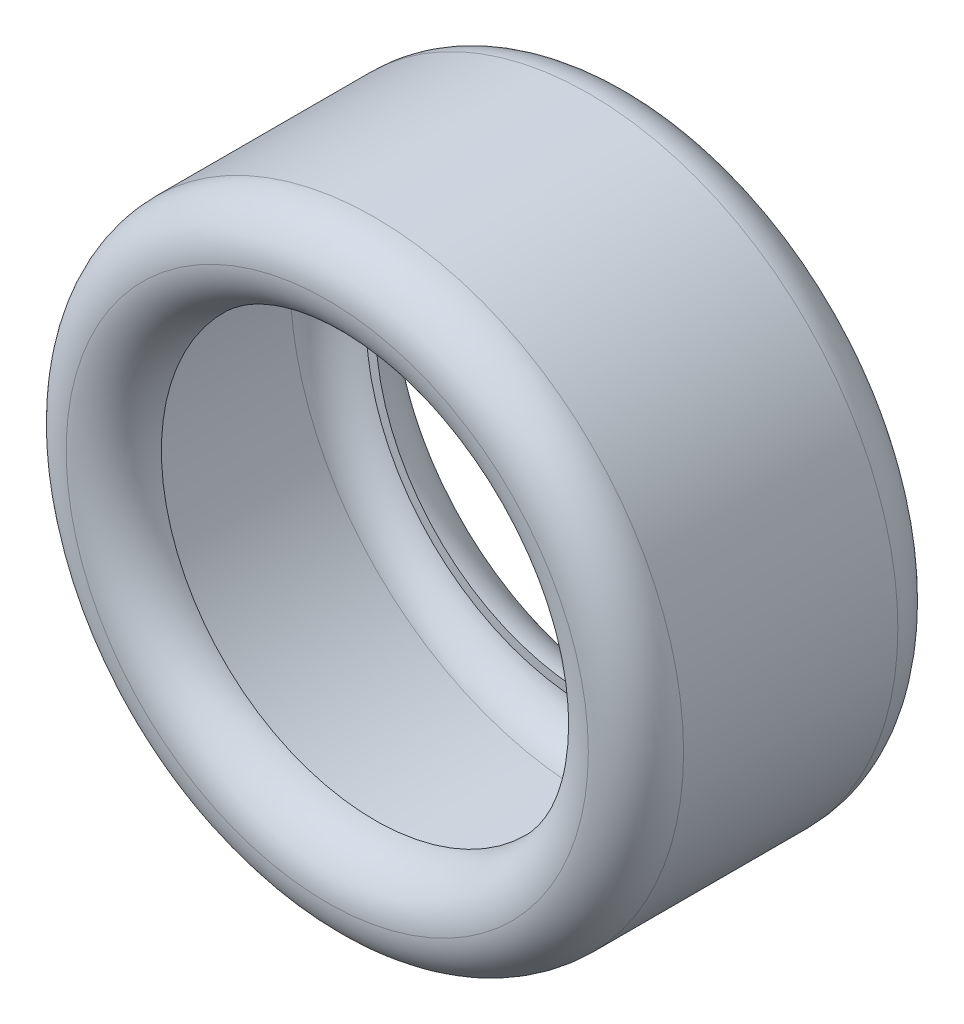
ISO-10303-21;
HEADER;
FILE_DESCRIPTION(('STEP AP214'),'2;1');
FILE_NAME('part.step','',(''),(''),'','','');
FILE_SCHEMA(('AUTOMOTIVE_DESIGN { 1 0 10303 214 1 1 1 1 }'));
ENDSEC;
DATA;
#1=APPLICATION_CONTEXT('core data for automotive mechanical design processes');
#2=APPLICATION_PROTOCOL_DEFINITION('international standard','automotive_design',2000,#1);
#3=PRODUCT_CONTEXT('',#1,'mechanical');
#4=PRODUCT('Part','Part','',(#3));
#5=PRODUCT_RELATED_PRODUCT_CATEGORY('part','',(#4));
#6=PRODUCT_DEFINITION_FORMATION('','',#4);
#7=PRODUCT_DEFINITION_CONTEXT('part definition',#1,'design');
#8=PRODUCT_DEFINITION('design','',#6,#7);
#9=PRODUCT_DEFINITION_SHAPE('','',#8);
#10=(LENGTH_UNIT() NAMED_UNIT(*) SI_UNIT(.MILLI.,.METRE.));
#11=(NAMED_UNIT(*) PLANE_ANGLE_UNIT() SI_UNIT($,.RADIAN.));
#12=(NAMED_UNIT(*) SI_UNIT($,.STERADIAN.) SOLID_ANGLE_UNIT());
#13=UNCERTAINTY_MEASURE_WITH_UNIT(LENGTH_MEASURE(1.E-05),#10,'distance_accuracy_value','');
#14=(GEOMETRIC_REPRESENTATION_CONTEXT(3) GLOBAL_UNCERTAINTY_ASSIGNED_CONTEXT((#13)) GLOBAL_UNIT_ASSIGNED_CONTEXT((#10,
#11,#12)) REPRESENTATION_CONTEXT('',''));
#15=CARTESIAN_POINT('',(0.,0.,0.));
#16=DIRECTION('',(0.,0.,1.));
#17=DIRECTION('',(1.,0.,0.));
#18=AXIS2_PLACEMENT_3D('',#15,#16,#17);
#19=CARTESIAN_POINT('',(0.,0.,55.));
#20=DIRECTION('',(0.,0.,1.));
#21=DIRECTION('',(1.,0.,0.));
#22=AXIS2_PLACEMENT_3D('',#19,#20,#21);
#23=TOROIDAL_SURFACE('',#22,54.83,10.);
#24=CARTESIAN_POINT('',(0.,0.,65.));
#25=DIRECTION('',(0.,0.,1.));
#26=DIRECTION('',(1.,0.,0.));
#27=AXIS2_PLACEMENT_3D('',#24,#25,#26);
#28=CIRCLE('',#27,54.83);
#29=CARTESIAN_POINT('',(54.83,0.,65.));
#30=VERTEX_POINT('',#29);
#31=EDGE_CURVE('E47',#30,#30,#28,.T.);
#32=ORIENTED_EDGE('',*,*,#31,.T.);
#33=EDGE_LOOP('',(#32));
#34=FACE_BOUND('',#33,.T.);
#35=CARTESIAN_POINT('',(0.,0.,55.));
#36=DIRECTION('',(0.,0.,1.));
#37=DIRECTION('',(1.,0.,0.));
#38=AXIS2_PLACEMENT_3D('',#35,#36,#37);
#39=CIRCLE('',#38,44.83);
#40=CARTESIAN_POINT('',(44.83,0.,55.));
#41=VERTEX_POINT('',#40);
#42=EDGE_CURVE('E62',#41,#41,#39,.T.);
#43=ORIENTED_EDGE('',*,*,#42,.F.);
#44=EDGE_LOOP('',(#43));
#45=FACE_BOUND('',#44,.T.);
#46=ADVANCED_FACE('F37',(#34,#45),#23,.T.);
#47=CARTESIAN_POINT('',(0.,0.,10.));
#48=DIRECTION('',(0.,0.,1.));
#49=DIRECTION('',(1.,0.,0.));
#50=AXIS2_PLACEMENT_3D('',#47,#48,#49);
#51=TOROIDAL_SURFACE('',#50,54.83,10.);
#52=CARTESIAN_POINT('',(0.,0.,10.));
#53=DIRECTION('',(0.,0.,1.));
#54=DIRECTION('',(1.,0.,0.));
#55=AXIS2_PLACEMENT_3D('',#52,#53,#54);
#56=CIRCLE('',#55,44.83);
#57=CARTESIAN_POINT('',(44.83,0.,10.));
#58=VERTEX_POINT('',#57);
#59=EDGE_CURVE('E66',#58,#58,#56,.F.);
#60=ORIENTED_EDGE('',*,*,#59,.F.);
#61=EDGE_LOOP('',(#60));
#62=FACE_BOUND('',#61,.T.);
#63=CARTESIAN_POINT('',(0.,0.,0.));
#64=DIRECTION('',(0.,0.,1.));
#65=DIRECTION('',(1.,0.,0.));
#66=AXIS2_PLACEMENT_3D('',#63,#64,#65);
#67=CIRCLE('',#66,54.83);
#68=CARTESIAN_POINT('',(54.83,0.,0.));
#69=VERTEX_POINT('',#68);
#70=EDGE_CURVE('E11',#69,#69,#67,.F.);
#71=ORIENTED_EDGE('',*,*,#70,.T.);
#72=EDGE_LOOP('',(#71));
#73=FACE_BOUND('',#72,.T.);
#74=ADVANCED_FACE('F84',(#62,#73),#51,.T.);
#75=CARTESIAN_POINT('',(0.,0.,10.));
#76=DIRECTION('',(0.,0.,1.));
#77=DIRECTION('',(1.,0.,0.));
#78=AXIS2_PLACEMENT_3D('',#75,#76,#77);
#79=TOROIDAL_SURFACE('',#78,54.83,10.);
#80=CARTESIAN_POINT('',(0.,0.,10.));
#81=DIRECTION('',(0.,0.,1.));
#82=DIRECTION('',(1.,0.,0.));
#83=AXIS2_PLACEMENT_3D('',#80,#81,#82);
#84=CIRCLE('',#83,64.83);
#85=CARTESIAN_POINT('',(64.83,0.,10.));
#86=VERTEX_POINT('',#85);
#87=EDGE_CURVE('E43',#86,#86,#84,.T.);
#88=ORIENTED_EDGE('',*,*,#87,.F.);
#89=EDGE_LOOP('',(#88));
#90=FACE_BOUND('',#89,.T.);
#91=ORIENTED_EDGE('',*,*,#70,.F.);
#92=EDGE_LOOP('',(#91));
#93=FACE_BOUND('',#92,.T.);
#94=ADVANCED_FACE('F86',(#90,#93),#79,.T.);
#95=CARTESIAN_POINT('',(0.,0.,55.));
#96=DIRECTION('',(0.,0.,1.));
#97=DIRECTION('',(1.,0.,0.));
#98=AXIS2_PLACEMENT_3D('',#95,#96,#97);
#99=TOROIDAL_SURFACE('',#98,54.83,10.);
#100=CARTESIAN_POINT('',(0.,0.,55.));
#101=DIRECTION('',(0.,0.,1.));
#102=DIRECTION('',(1.,0.,0.));
#103=AXIS2_PLACEMENT_3D('',#100,#101,#102);
#104=CIRCLE('',#103,64.83);
#105=CARTESIAN_POINT('',(64.83,0.,55.));
#106=VERTEX_POINT('',#105);
#107=EDGE_CURVE('E51',#106,#106,#104,.F.);
#108=ORIENTED_EDGE('',*,*,#107,.F.);
#109=EDGE_LOOP('',(#108));
#110=FACE_BOUND('',#109,.T.);
#111=ORIENTED_EDGE('',*,*,#31,.F.);
#112=EDGE_LOOP('',(#111));
#113=FACE_BOUND('',#112,.T.);
#114=ADVANCED_FACE('F91',(#110,#113),#99,.T.);
#115=CARTESIAN_POINT('',(0.,0.,65.));
#116=DIRECTION('',(0.,0.,-1.));
#117=DIRECTION('',(-1.,0.,0.));
#118=AXIS2_PLACEMENT_3D('',#115,#116,#117);
#119=CYLINDRICAL_SURFACE('',#118,64.83);
#120=ORIENTED_EDGE('',*,*,#87,.T.);
#121=EDGE_LOOP('',(#120));
#122=FACE_BOUND('',#121,.T.);
#123=ORIENTED_EDGE('',*,*,#107,.T.);
#124=EDGE_LOOP('',(#123));
#125=FACE_BOUND('',#124,.T.);
#126=ADVANCED_FACE('F98',(#122,#125),#119,.T.);
#127=CARTESIAN_POINT('',(0.,0.,10.));
#128=DIRECTION('',(0.,0.,-1.));
#129=DIRECTION('',(-1.,0.,0.));
#130=AXIS2_PLACEMENT_3D('',#127,#128,#129);
#131=PLANE('',#130);
#132=ORIENTED_EDGE('',*,*,#59,.T.);
#133=EDGE_LOOP('',(#132));
#134=FACE_BOUND('',#133,.T.);
#135=CARTESIAN_POINT('',(0.,0.,10.));
#136=DIRECTION('',(0.,0.,1.));
#137=DIRECTION('',(1.,0.,0.));
#138=AXIS2_PLACEMENT_3D('',#135,#136,#137);
#139=CIRCLE('',#138,46.83);
#140=CARTESIAN_POINT('',(46.83,0.,10.));
#141=VERTEX_POINT('',#140);
#142=EDGE_CURVE('E56',#141,#141,#139,.F.);
#143=ORIENTED_EDGE('',*,*,#142,.F.);
#144=EDGE_LOOP('',(#143));
#145=FACE_BOUND('',#144,.T.);
#146=ADVANCED_FACE('F81',(#134,#145),#131,.F.);
#147=CARTESIAN_POINT('',(0.,0.,55.));
#148=DIRECTION('',(0.,0.,-1.));
#149=DIRECTION('',(-1.,0.,0.));
#150=AXIS2_PLACEMENT_3D('',#147,#148,#149);
#151=PLANE('',#150);
#152=ORIENTED_EDGE('',*,*,#42,.T.);
#153=EDGE_LOOP('',(#152));
#154=FACE_BOUND('',#153,.T.);
#155=CARTESIAN_POINT('',(0.,0.,55.));
#156=DIRECTION('',(0.,0.,1.));
#157=DIRECTION('',(1.,0.,0.));
#158=AXIS2_PLACEMENT_3D('',#155,#156,#157);
#159=CIRCLE('',#158,46.83);
#160=CARTESIAN_POINT('',(46.83,0.,55.));
#161=VERTEX_POINT('',#160);
#162=EDGE_CURVE('E59',#161,#161,#159,.T.);
#163=ORIENTED_EDGE('',*,*,#162,.F.);
#164=EDGE_LOOP('',(#163));
#165=FACE_BOUND('',#164,.T.);
#166=ADVANCED_FACE('F121',(#154,#165),#151,.T.);
#167=CARTESIAN_POINT('',(0.,0.,55.));
#168=DIRECTION('',(0.,0.,1.));
#169=DIRECTION('',(1.,0.,0.));
#170=AXIS2_PLACEMENT_3D('',#167,#168,#169);
#171=TOROIDAL_SURFACE('',#170,54.83,8.);
#172=CARTESIAN_POINT('',(0.,0.,63.));
#173=DIRECTION('',(0.,0.,1.));
#174=DIRECTION('',(1.,0.,0.));
#175=AXIS2_PLACEMENT_3D('',#172,#173,#174);
#176=CIRCLE('',#175,54.83);
#177=CARTESIAN_POINT('',(54.83,0.,63.));
#178=VERTEX_POINT('',#177);
#179=EDGE_CURVE('E70',#178,#178,#176,.T.);
#180=ORIENTED_EDGE('',*,*,#179,.F.);
#181=EDGE_LOOP('',(#180));
#182=FACE_BOUND('',#181,.T.);
#183=ORIENTED_EDGE('',*,*,#162,.T.);
#184=EDGE_LOOP('',(#183));
#185=FACE_BOUND('',#184,.T.);
#186=ADVANCED_FACE('F117',(#182,#185),#171,.F.);
#187=CARTESIAN_POINT('',(0.,0.,10.));
#188=DIRECTION('',(0.,0.,1.));
#189=DIRECTION('',(1.,0.,0.));
#190=AXIS2_PLACEMENT_3D('',#187,#188,#189);
#191=TOROIDAL_SURFACE('',#190,54.83,8.);
#192=ORIENTED_EDGE('',*,*,#142,.T.);
#193=EDGE_LOOP('',(#192));
#194=FACE_BOUND('',#193,.T.);
#195=CARTESIAN_POINT('',(0.,0.,2.));
#196=DIRECTION('',(0.,0.,1.));
#197=DIRECTION('',(1.,0.,0.));
#198=AXIS2_PLACEMENT_3D('',#195,#196,#197);
#199=CIRCLE('',#198,54.83);
#200=CARTESIAN_POINT('',(54.83,0.,2.));
#201=VERTEX_POINT('',#200);
#202=EDGE_CURVE('E63',#201,#201,#199,.F.);
#203=ORIENTED_EDGE('',*,*,#202,.F.);
#204=EDGE_LOOP('',(#203));
#205=FACE_BOUND('',#204,.T.);
#206=ADVANCED_FACE('F113',(#194,#205),#191,.F.);
#207=CARTESIAN_POINT('',(0.,0.,10.));
#208=DIRECTION('',(0.,0.,1.));
#209=DIRECTION('',(1.,0.,0.));
#210=AXIS2_PLACEMENT_3D('',#207,#208,#209);
#211=TOROIDAL_SURFACE('',#210,54.83,8.);
#212=CARTESIAN_POINT('',(0.,0.,10.));
#213=DIRECTION('',(0.,0.,-1.));
#214=DIRECTION('',(-1.,0.,0.));
#215=AXIS2_PLACEMENT_3D('',#212,#213,#214);
#216=CIRCLE('',#215,62.83);
#217=CARTESIAN_POINT('',(-62.83,0.,10.));
#218=VERTEX_POINT('',#217);
#219=EDGE_CURVE('E67',#218,#218,#216,.F.);
#220=ORIENTED_EDGE('',*,*,#219,.T.);
#221=EDGE_LOOP('',(#220));
#222=FACE_BOUND('',#221,.T.);
#223=ORIENTED_EDGE('',*,*,#202,.T.);
#224=EDGE_LOOP('',(#223));
#225=FACE_BOUND('',#224,.T.);
#226=ADVANCED_FACE('F109',(#222,#225),#211,.F.);
#227=CARTESIAN_POINT('',(0.,0.,55.));
#228=DIRECTION('',(0.,0.,1.));
#229=DIRECTION('',(1.,0.,0.));
#230=AXIS2_PLACEMENT_3D('',#227,#228,#229);
#231=TOROIDAL_SURFACE('',#230,54.83,8.);
#232=CARTESIAN_POINT('',(0.,0.,55.));
#233=DIRECTION('',(0.,0.,-1.));
#234=DIRECTION('',(-1.,0.,0.));
#235=AXIS2_PLACEMENT_3D('',#232,#233,#234);
#236=CIRCLE('',#235,62.83);
#237=CARTESIAN_POINT('',(-62.83,0.,55.));
#238=VERTEX_POINT('',#237);
#239=EDGE_CURVE('E71',#238,#238,#236,.T.);
#240=ORIENTED_EDGE('',*,*,#239,.T.);
#241=EDGE_LOOP('',(#240));
#242=FACE_BOUND('',#241,.T.);
#243=ORIENTED_EDGE('',*,*,#179,.T.);
#244=EDGE_LOOP('',(#243));
#245=FACE_BOUND('',#244,.T.);
#246=ADVANCED_FACE('F105',(#242,#245),#231,.F.);
#247=CARTESIAN_POINT('',(0.,0.,65.));
#248=DIRECTION('',(0.,0.,-1.));
#249=DIRECTION('',(-1.,0.,0.));
#250=AXIS2_PLACEMENT_3D('',#247,#248,#249);
#251=CYLINDRICAL_SURFACE('',#250,62.83);
#252=ORIENTED_EDGE('',*,*,#219,.F.);
#253=EDGE_LOOP('',(#252));
#254=FACE_BOUND('',#253,.T.);
#255=ORIENTED_EDGE('',*,*,#239,.F.);
#256=EDGE_LOOP('',(#255));
#257=FACE_BOUND('',#256,.T.);
#258=ADVANCED_FACE('F102',(#254,#257),#251,.F.);
#259=CLOSED_SHELL('',(#46,#74,#94,#114,#126,#146,#166,#186,#206,#226,#246,#258));
#260=MANIFOLD_SOLID_BREP('B2',#259);
#261=ADVANCED_BREP_SHAPE_REPRESENTATION('',(#18,#260),#14);
#262=SHAPE_DEFINITION_REPRESENTATION(#9,#261);
ENDSEC;
END-ISO-10303-21;
